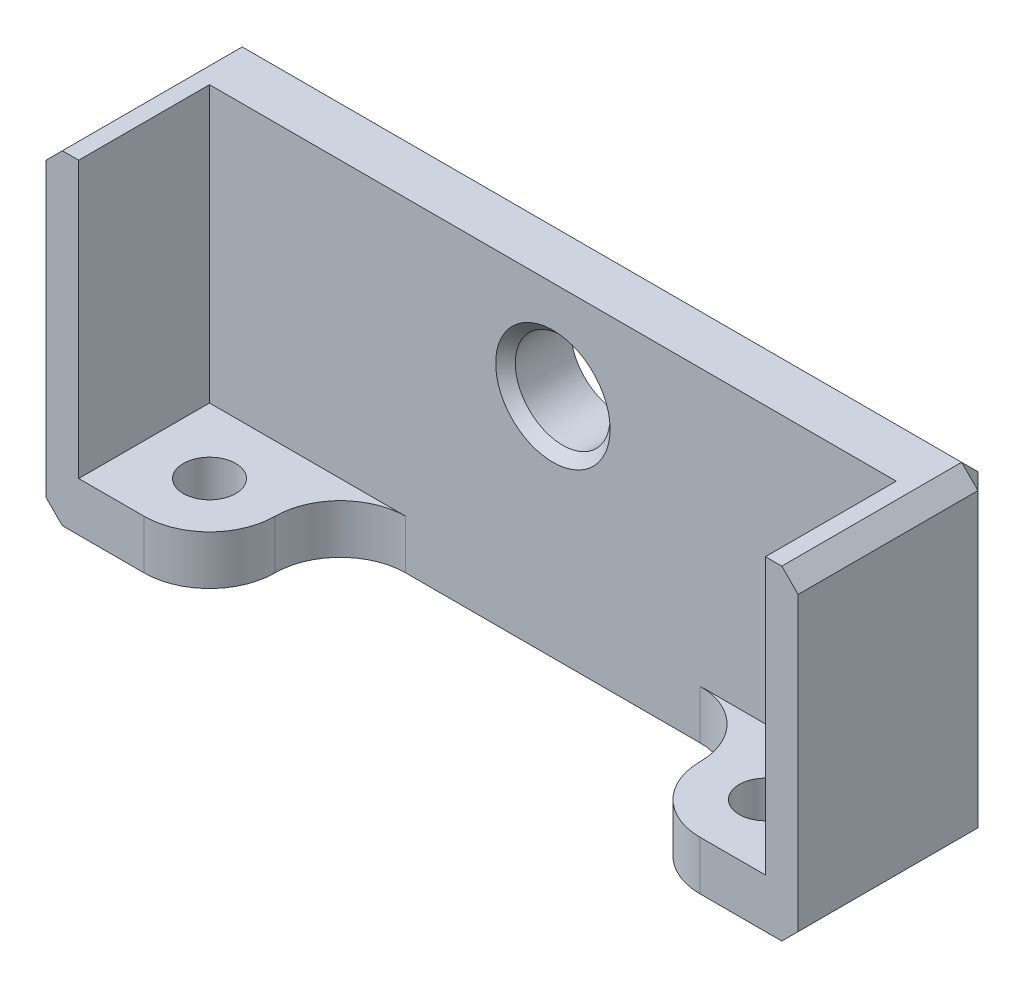
ISO-10303-21;
HEADER;
FILE_DESCRIPTION(('STEP AP214'),'2;1');
FILE_NAME('part.step','',(''),(''),'','','');
FILE_SCHEMA(('AUTOMOTIVE_DESIGN { 1 0 10303 214 1 1 1 1 }'));
ENDSEC;
DATA;
#1=APPLICATION_CONTEXT('core data for automotive mechanical design processes');
#2=APPLICATION_PROTOCOL_DEFINITION('international standard','automotive_design',2000,#1);
#3=PRODUCT_CONTEXT('',#1,'mechanical');
#4=PRODUCT('Part','Part','',(#3));
#5=PRODUCT_RELATED_PRODUCT_CATEGORY('part','',(#4));
#6=PRODUCT_DEFINITION_FORMATION('','',#4);
#7=PRODUCT_DEFINITION_CONTEXT('part definition',#1,'design');
#8=PRODUCT_DEFINITION('design','',#6,#7);
#9=PRODUCT_DEFINITION_SHAPE('','',#8);
#10=(LENGTH_UNIT() NAMED_UNIT(*) SI_UNIT(.MILLI.,.METRE.));
#11=(NAMED_UNIT(*) PLANE_ANGLE_UNIT() SI_UNIT($,.RADIAN.));
#12=(NAMED_UNIT(*) SI_UNIT($,.STERADIAN.) SOLID_ANGLE_UNIT());
#13=UNCERTAINTY_MEASURE_WITH_UNIT(LENGTH_MEASURE(1.E-05),#10,'distance_accuracy_value','');
#14=(GEOMETRIC_REPRESENTATION_CONTEXT(3) GLOBAL_UNCERTAINTY_ASSIGNED_CONTEXT((#13)) GLOBAL_UNIT_ASSIGNED_CONTEXT((#10,
#11,#12)) REPRESENTATION_CONTEXT('',''));
#15=CARTESIAN_POINT('',(0.,0.,0.));
#16=DIRECTION('',(0.,0.,1.));
#17=DIRECTION('',(1.,0.,0.));
#18=AXIS2_PLACEMENT_3D('',#15,#16,#17);
#19=CARTESIAN_POINT('',(0.,0.,4.));
#20=DIRECTION('',(0.,0.,1.));
#21=DIRECTION('',(1.,0.,0.));
#22=AXIS2_PLACEMENT_3D('',#19,#20,#21);
#23=PLANE('',#22);
#24=DIRECTION('',(1.,0.,0.));
#25=VECTOR('',#24,1.);
#26=CARTESIAN_POINT('',(7.93725393319378,-13.86,4.));
#27=LINE('',#26,#25);
#28=CARTESIAN_POINT('',(-9.,-13.86,4.));
#29=VERTEX_POINT('',#28);
#30=CARTESIAN_POINT('',(9.00000000000001,-13.86,4.));
#31=VERTEX_POINT('',#30);
#32=EDGE_CURVE('E231',#29,#31,#27,.T.);
#33=ORIENTED_EDGE('',*,*,#32,.T.);
#34=DIRECTION('',(0.,-1.,0.));
#35=VECTOR('',#34,1.);
#36=CARTESIAN_POINT('',(9.00000000000001,-10.86,4.));
#37=LINE('',#36,#35);
#38=CARTESIAN_POINT('',(9.00000000000001,-10.86,4.));
#39=VERTEX_POINT('',#38);
#40=EDGE_CURVE('E254',#31,#39,#37,.F.);
#41=ORIENTED_EDGE('',*,*,#40,.T.);
#42=DIRECTION('',(-1.,0.,0.));
#43=VECTOR('',#42,1.);
#44=CARTESIAN_POINT('',(0.,-10.86,4.));
#45=LINE('',#44,#43);
#46=CARTESIAN_POINT('',(21.,-10.86,4.));
#47=VERTEX_POINT('',#46);
#48=EDGE_CURVE('E446',#47,#39,#45,.T.);
#49=ORIENTED_EDGE('',*,*,#48,.F.);
#50=DIRECTION('',(0.,1.,0.));
#51=VECTOR('',#50,1.);
#52=CARTESIAN_POINT('',(21.,-13.86,4.));
#53=LINE('',#52,#51);
#54=CARTESIAN_POINT('',(21.,6.,4.));
#55=VERTEX_POINT('',#54);
#56=EDGE_CURVE('E235',#47,#55,#53,.T.);
#57=ORIENTED_EDGE('',*,*,#56,.T.);
#58=DIRECTION('',(-1.,0.,0.));
#59=VECTOR('',#58,1.);
#60=CARTESIAN_POINT('',(21.,6.,4.));
#61=LINE('',#60,#59);
#62=CARTESIAN_POINT('',(-21.,6.,4.));
#63=VERTEX_POINT('',#62);
#64=EDGE_CURVE('E238',#55,#63,#61,.T.);
#65=ORIENTED_EDGE('',*,*,#64,.T.);
#66=DIRECTION('',(0.,-1.,0.));
#67=VECTOR('',#66,1.);
#68=CARTESIAN_POINT('',(-21.,-13.86,4.));
#69=LINE('',#68,#67);
#70=CARTESIAN_POINT('',(-21.,-10.86,4.));
#71=VERTEX_POINT('',#70);
#72=EDGE_CURVE('E228',#63,#71,#69,.T.);
#73=ORIENTED_EDGE('',*,*,#72,.T.);
#74=DIRECTION('',(-1.,0.,0.));
#75=VECTOR('',#74,1.);
#76=CARTESIAN_POINT('',(0.,-10.86,4.));
#77=LINE('',#76,#75);
#78=CARTESIAN_POINT('',(-9.,-10.86,4.));
#79=VERTEX_POINT('',#78);
#80=EDGE_CURVE('E199',#79,#71,#77,.T.);
#81=ORIENTED_EDGE('',*,*,#80,.F.);
#82=DIRECTION('',(0.,1.,0.));
#83=VECTOR('',#82,1.);
#84=CARTESIAN_POINT('',(-9.,-13.86,4.));
#85=LINE('',#84,#83);
#86=EDGE_CURVE('E250',#79,#29,#85,.F.);
#87=ORIENTED_EDGE('',*,*,#86,.T.);
#88=EDGE_LOOP('',(#33,#41,#49,#57,#65,#73,#81,#87));
#89=FACE_BOUND('',#88,.T.);
#90=CARTESIAN_POINT('',(0.,0.,4.));
#91=DIRECTION('',(0.,0.,1.));
#92=DIRECTION('',(1.,0.,0.));
#93=AXIS2_PLACEMENT_3D('',#90,#91,#92);
#94=CIRCLE('',#93,3.5);
#95=CARTESIAN_POINT('',(3.5,0.,4.));
#96=VERTEX_POINT('',#95);
#97=EDGE_CURVE('E246',#96,#96,#94,.F.);
#98=ORIENTED_EDGE('',*,*,#97,.T.);
#99=EDGE_LOOP('',(#98));
#100=FACE_BOUND('',#99,.T.);
#101=ADVANCED_FACE('F41',(#89,#100),#23,.T.);
#102=CARTESIAN_POINT('',(0.,0.,0.));
#103=DIRECTION('',(0.,0.,1.));
#104=DIRECTION('',(1.,0.,0.));
#105=AXIS2_PLACEMENT_3D('',#102,#103,#104);
#106=PLANE('',#105);
#107=DIRECTION('',(1.,0.,0.));
#108=VECTOR('',#107,1.);
#109=CARTESIAN_POINT('',(0.,4.99999999999999,0.));
#110=LINE('',#109,#108);
#111=CARTESIAN_POINT('',(-22.,4.99999999999998,0.));
#112=VERTEX_POINT('',#111);
#113=CARTESIAN_POINT('',(22.,4.99999999999999,0.));
#114=VERTEX_POINT('',#113);
#115=EDGE_CURVE('E347',#112,#114,#110,.T.);
#116=ORIENTED_EDGE('',*,*,#115,.T.);
#117=DIRECTION('',(0.,-1.,0.));
#118=VECTOR('',#117,1.);
#119=CARTESIAN_POINT('',(22.,0.,0.));
#120=LINE('',#119,#118);
#121=CARTESIAN_POINT('',(22.,-12.86,0.));
#122=VERTEX_POINT('',#121);
#123=EDGE_CURVE('E11',#114,#122,#120,.T.);
#124=ORIENTED_EDGE('',*,*,#123,.T.);
#125=DIRECTION('',(-1.,0.,0.));
#126=VECTOR('',#125,1.);
#127=CARTESIAN_POINT('',(0.,-12.86,0.));
#128=LINE('',#127,#126);
#129=CARTESIAN_POINT('',(-22.,-12.86,0.));
#130=VERTEX_POINT('',#129);
#131=EDGE_CURVE('E52',#122,#130,#128,.T.);
#132=ORIENTED_EDGE('',*,*,#131,.T.);
#133=DIRECTION('',(0.,1.,0.));
#134=VECTOR('',#133,1.);
#135=CARTESIAN_POINT('',(-22.,0.,0.));
#136=LINE('',#135,#134);
#137=EDGE_CURVE('E350',#130,#112,#136,.T.);
#138=ORIENTED_EDGE('',*,*,#137,.T.);
#139=EDGE_LOOP('',(#116,#124,#132,#138));
#140=FACE_BOUND('',#139,.T.);
#141=CARTESIAN_POINT('',(0.,0.,0.));
#142=DIRECTION('',(0.,0.,1.));
#143=DIRECTION('',(1.,0.,0.));
#144=AXIS2_PLACEMENT_3D('',#141,#142,#143);
#145=CIRCLE('',#144,2.9);
#146=CARTESIAN_POINT('',(2.9,0.,0.));
#147=VERTEX_POINT('',#146);
#148=EDGE_CURVE('E224',#147,#147,#145,.T.);
#149=ORIENTED_EDGE('',*,*,#148,.T.);
#150=EDGE_LOOP('',(#149));
#151=FACE_BOUND('',#150,.T.);
#152=ADVANCED_FACE('F471',(#140,#151),#106,.F.);
#153=CARTESIAN_POINT('',(21.,-13.86,4.));
#154=DIRECTION('',(0.,1.,0.));
#155=DIRECTION('',(-1.,0.,0.));
#156=AXIS2_PLACEMENT_3D('',#153,#154,#155);
#157=PLANE('',#156);
#158=DIRECTION('',(1.,0.,0.));
#159=VECTOR('',#158,1.);
#160=CARTESIAN_POINT('',(-23.,-13.86,12.));
#161=LINE('',#160,#159);
#162=CARTESIAN_POINT('',(-22.,-13.86,12.));
#163=VERTEX_POINT('',#162);
#164=CARTESIAN_POINT('',(-17.,-13.86,12.));
#165=VERTEX_POINT('',#164);
#166=EDGE_CURVE('E218',#163,#165,#161,.T.);
#167=ORIENTED_EDGE('',*,*,#166,.F.);
#168=DIRECTION('',(0.,0.,-1.));
#169=VECTOR('',#168,1.);
#170=CARTESIAN_POINT('',(-22.,-13.86,4.));
#171=LINE('',#170,#169);
#172=CARTESIAN_POINT('',(-22.,-13.86,1.00000000000001));
#173=VERTEX_POINT('',#172);
#174=EDGE_CURVE('E320',#163,#173,#171,.T.);
#175=ORIENTED_EDGE('',*,*,#174,.T.);
#176=DIRECTION('',(1.,0.,0.));
#177=VECTOR('',#176,1.);
#178=CARTESIAN_POINT('',(21.,-13.86,1.00000000000001));
#179=LINE('',#178,#177);
#180=CARTESIAN_POINT('',(22.,-13.86,1.00000000000001));
#181=VERTEX_POINT('',#180);
#182=EDGE_CURVE('E314',#173,#181,#179,.T.);
#183=ORIENTED_EDGE('',*,*,#182,.T.);
#184=DIRECTION('',(0.,0.,1.));
#185=VECTOR('',#184,1.);
#186=CARTESIAN_POINT('',(22.,-13.86,4.));
#187=LINE('',#186,#185);
#188=CARTESIAN_POINT('',(22.,-13.86,12.));
#189=VERTEX_POINT('',#188);
#190=EDGE_CURVE('E317',#181,#189,#187,.T.);
#191=ORIENTED_EDGE('',*,*,#190,.T.);
#192=DIRECTION('',(-1.,0.,0.));
#193=VECTOR('',#192,1.);
#194=CARTESIAN_POINT('',(23.,-13.86,12.));
#195=LINE('',#194,#193);
#196=CARTESIAN_POINT('',(17.,-13.86,12.));
#197=VERTEX_POINT('',#196);
#198=EDGE_CURVE('E208',#189,#197,#195,.T.);
#199=ORIENTED_EDGE('',*,*,#198,.T.);
#200=CARTESIAN_POINT('',(17.,-13.86,8.));
#201=DIRECTION('',(0.,1.,0.));
#202=DIRECTION('',(-1.,0.,0.));
#203=AXIS2_PLACEMENT_3D('',#200,#201,#202);
#204=CIRCLE('',#203,4.);
#205=CARTESIAN_POINT('',(13.,-13.86,8.));
#206=VERTEX_POINT('',#205);
#207=EDGE_CURVE('E266',#197,#206,#204,.F.);
#208=ORIENTED_EDGE('',*,*,#207,.T.);
#209=CARTESIAN_POINT('',(9.00000000000001,-13.86,8.));
#210=DIRECTION('',(0.,1.,0.));
#211=DIRECTION('',(-1.,0.,0.));
#212=AXIS2_PLACEMENT_3D('',#209,#210,#211);
#213=CIRCLE('',#212,4.);
#214=EDGE_CURVE('E277',#206,#31,#213,.T.);
#215=ORIENTED_EDGE('',*,*,#214,.T.);
#216=ORIENTED_EDGE('',*,*,#32,.F.);
#217=CARTESIAN_POINT('',(-9.,-13.86,8.));
#218=DIRECTION('',(0.,1.,0.));
#219=DIRECTION('',(-1.,0.,0.));
#220=AXIS2_PLACEMENT_3D('',#217,#218,#219);
#221=CIRCLE('',#220,4.);
#222=CARTESIAN_POINT('',(-13.,-13.86,8.));
#223=VERTEX_POINT('',#222);
#224=EDGE_CURVE('E286',#29,#223,#221,.T.);
#225=ORIENTED_EDGE('',*,*,#224,.T.);
#226=CARTESIAN_POINT('',(-17.,-13.86,8.));
#227=DIRECTION('',(0.,1.,0.));
#228=DIRECTION('',(-1.,0.,0.));
#229=AXIS2_PLACEMENT_3D('',#226,#227,#228);
#230=CIRCLE('',#229,4.);
#231=EDGE_CURVE('E262',#223,#165,#230,.F.);
#232=ORIENTED_EDGE('',*,*,#231,.T.);
#233=EDGE_LOOP('',(#167,#175,#183,#191,#199,#208,#215,#216,#225,#232));
#234=FACE_BOUND('',#233,.T.);
#235=CARTESIAN_POINT('',(-17.,-13.86,8.));
#236=DIRECTION('',(0.,-1.,0.));
#237=DIRECTION('',(1.,0.,0.));
#238=AXIS2_PLACEMENT_3D('',#235,#236,#237);
#239=CIRCLE('',#238,1.6);
#240=CARTESIAN_POINT('',(-15.4,-13.86,8.));
#241=VERTEX_POINT('',#240);
#242=EDGE_CURVE('E442',#241,#241,#239,.T.);
#243=ORIENTED_EDGE('',*,*,#242,.F.);
#244=EDGE_LOOP('',(#243));
#245=FACE_BOUND('',#244,.T.);
#246=CARTESIAN_POINT('',(17.,-13.86,8.));
#247=DIRECTION('',(0.,-1.,0.));
#248=DIRECTION('',(-1.,0.,0.));
#249=AXIS2_PLACEMENT_3D('',#246,#247,#248);
#250=CIRCLE('',#249,1.6);
#251=CARTESIAN_POINT('',(15.4,-13.86,8.));
#252=VERTEX_POINT('',#251);
#253=EDGE_CURVE('E294',#252,#252,#250,.T.);
#254=ORIENTED_EDGE('',*,*,#253,.F.);
#255=EDGE_LOOP('',(#254));
#256=FACE_BOUND('',#255,.T.);
#257=ADVANCED_FACE('F468',(#234,#245,#256),#157,.F.);
#258=CARTESIAN_POINT('',(7.93725393319377,6.,4.));
#259=DIRECTION('',(0.,-1.,0.));
#260=DIRECTION('',(1.,0.,0.));
#261=AXIS2_PLACEMENT_3D('',#258,#259,#260);
#262=PLANE('',#261);
#263=DIRECTION('',(-1.,0.,0.));
#264=VECTOR('',#263,1.);
#265=CARTESIAN_POINT('',(7.93725393319377,6.,1.00000000000001));
#266=LINE('',#265,#264);
#267=CARTESIAN_POINT('',(22.,6.,1.00000000000001));
#268=VERTEX_POINT('',#267);
#269=CARTESIAN_POINT('',(-22.,6.,1.00000000000001));
#270=VERTEX_POINT('',#269);
#271=EDGE_CURVE('E323',#268,#270,#266,.T.);
#272=ORIENTED_EDGE('',*,*,#271,.T.);
#273=DIRECTION('',(0.,0.,1.));
#274=VECTOR('',#273,1.);
#275=CARTESIAN_POINT('',(-22.,6.,4.));
#276=LINE('',#275,#274);
#277=CARTESIAN_POINT('',(-22.,6.,12.));
#278=VERTEX_POINT('',#277);
#279=EDGE_CURVE('E329',#270,#278,#276,.T.);
#280=ORIENTED_EDGE('',*,*,#279,.T.);
#281=DIRECTION('',(1.,0.,0.));
#282=VECTOR('',#281,1.);
#283=CARTESIAN_POINT('',(-23.,6.,12.));
#284=LINE('',#283,#282);
#285=CARTESIAN_POINT('',(-21.,6.,12.));
#286=VERTEX_POINT('',#285);
#287=EDGE_CURVE('E221',#278,#286,#284,.T.);
#288=ORIENTED_EDGE('',*,*,#287,.T.);
#289=DIRECTION('',(0.,0.,-1.));
#290=VECTOR('',#289,1.);
#291=CARTESIAN_POINT('',(-21.,6.,12.));
#292=LINE('',#291,#290);
#293=EDGE_CURVE('E206',#286,#63,#292,.T.);
#294=ORIENTED_EDGE('',*,*,#293,.T.);
#295=ORIENTED_EDGE('',*,*,#64,.F.);
#296=DIRECTION('',(0.,0.,-1.));
#297=VECTOR('',#296,1.);
#298=CARTESIAN_POINT('',(21.,6.,12.));
#299=LINE('',#298,#297);
#300=CARTESIAN_POINT('',(21.,6.,12.));
#301=VERTEX_POINT('',#300);
#302=EDGE_CURVE('E423',#301,#55,#299,.T.);
#303=ORIENTED_EDGE('',*,*,#302,.F.);
#304=DIRECTION('',(-1.,0.,0.));
#305=VECTOR('',#304,1.);
#306=CARTESIAN_POINT('',(23.,6.,12.));
#307=LINE('',#306,#305);
#308=CARTESIAN_POINT('',(22.,6.,12.));
#309=VERTEX_POINT('',#308);
#310=EDGE_CURVE('E214',#309,#301,#307,.T.);
#311=ORIENTED_EDGE('',*,*,#310,.F.);
#312=DIRECTION('',(0.,0.,-1.));
#313=VECTOR('',#312,1.);
#314=CARTESIAN_POINT('',(22.,6.,4.));
#315=LINE('',#314,#313);
#316=EDGE_CURVE('E326',#309,#268,#315,.T.);
#317=ORIENTED_EDGE('',*,*,#316,.T.);
#318=EDGE_LOOP('',(#272,#280,#288,#294,#295,#303,#311,#317));
#319=FACE_BOUND('',#318,.T.);
#320=ADVANCED_FACE('F470',(#319),#262,.F.);
#321=CARTESIAN_POINT('',(0.,0.,4.));
#322=DIRECTION('',(0.,0.,-1.));
#323=DIRECTION('',(-1.,0.,0.));
#324=AXIS2_PLACEMENT_3D('',#321,#322,#323);
#325=CYLINDRICAL_SURFACE('',#324,2.9);
#326=CARTESIAN_POINT('',(0.,0.,3.4));
#327=DIRECTION('',(0.,0.,1.));
#328=DIRECTION('',(1.,0.,0.));
#329=AXIS2_PLACEMENT_3D('',#326,#327,#328);
#330=CIRCLE('',#329,2.9);
#331=CARTESIAN_POINT('',(2.9,0.,3.4));
#332=VERTEX_POINT('',#331);
#333=EDGE_CURVE('E242',#332,#332,#330,.T.);
#334=ORIENTED_EDGE('',*,*,#333,.T.);
#335=EDGE_LOOP('',(#334));
#336=FACE_BOUND('',#335,.T.);
#337=ORIENTED_EDGE('',*,*,#148,.F.);
#338=EDGE_LOOP('',(#337));
#339=FACE_BOUND('',#338,.T.);
#340=ADVANCED_FACE('F478',(#336,#339),#325,.F.);
#341=CARTESIAN_POINT('',(0.,0.,3.4));
#342=DIRECTION('',(0.,0.,1.));
#343=DIRECTION('',(1.,0.,0.));
#344=AXIS2_PLACEMENT_3D('',#341,#342,#343);
#345=CONICAL_SURFACE('',#344,2.9,0.785398163397449);
#346=ORIENTED_EDGE('',*,*,#97,.F.);
#347=EDGE_LOOP('',(#346));
#348=FACE_BOUND('',#347,.T.);
#349=ORIENTED_EDGE('',*,*,#333,.F.);
#350=EDGE_LOOP('',(#349));
#351=FACE_BOUND('',#350,.T.);
#352=ADVANCED_FACE('F494',(#348,#351),#345,.F.);
#353=CARTESIAN_POINT('',(-21.,0.,0.));
#354=DIRECTION('',(1.,0.,0.));
#355=DIRECTION('',(0.,1.,0.));
#356=AXIS2_PLACEMENT_3D('',#353,#354,#355);
#357=PLANE('',#356);
#358=DIRECTION('',(0.,0.,1.));
#359=VECTOR('',#358,1.);
#360=CARTESIAN_POINT('',(-21.,-10.86,0.));
#361=LINE('',#360,#359);
#362=CARTESIAN_POINT('',(-21.,-10.86,12.));
#363=VERTEX_POINT('',#362);
#364=EDGE_CURVE('E193',#71,#363,#361,.T.);
#365=ORIENTED_EDGE('',*,*,#364,.F.);
#366=ORIENTED_EDGE('',*,*,#72,.F.);
#367=ORIENTED_EDGE('',*,*,#293,.F.);
#368=DIRECTION('',(0.,1.,0.));
#369=VECTOR('',#368,1.);
#370=CARTESIAN_POINT('',(-21.,6.,12.));
#371=LINE('',#370,#369);
#372=EDGE_CURVE('E186',#363,#286,#371,.T.);
#373=ORIENTED_EDGE('',*,*,#372,.F.);
#374=EDGE_LOOP('',(#365,#366,#367,#373));
#375=FACE_BOUND('',#374,.T.);
#376=ADVANCED_FACE('F204',(#375),#357,.T.);
#377=CARTESIAN_POINT('',(-23.,6.,12.));
#378=DIRECTION('',(0.,0.,-1.));
#379=DIRECTION('',(0.,1.,0.));
#380=AXIS2_PLACEMENT_3D('',#377,#378,#379);
#381=PLANE('',#380);
#382=DIRECTION('',(0.,1.,0.));
#383=VECTOR('',#382,1.);
#384=CARTESIAN_POINT('',(-23.,6.,12.));
#385=LINE('',#384,#383);
#386=CARTESIAN_POINT('',(-23.,-12.86,12.));
#387=VERTEX_POINT('',#386);
#388=CARTESIAN_POINT('',(-23.,4.99999999999999,12.));
#389=VERTEX_POINT('',#388);
#390=EDGE_CURVE('E212',#387,#389,#385,.T.);
#391=ORIENTED_EDGE('',*,*,#390,.F.);
#392=DIRECTION('',(-0.707106781186548,0.707106781186548,0.));
#393=VECTOR('',#392,1.);
#394=CARTESIAN_POINT('',(-23.,-12.86,12.));
#395=LINE('',#394,#393);
#396=EDGE_CURVE('E311',#387,#163,#395,.F.);
#397=ORIENTED_EDGE('',*,*,#396,.T.);
#398=ORIENTED_EDGE('',*,*,#166,.T.);
#399=DIRECTION('',(0.,-1.,0.));
#400=VECTOR('',#399,1.);
#401=CARTESIAN_POINT('',(-17.,-10.86,12.));
#402=LINE('',#401,#400);
#403=CARTESIAN_POINT('',(-17.,-10.86,12.));
#404=VERTEX_POINT('',#403);
#405=EDGE_CURVE('E189',#165,#404,#402,.F.);
#406=ORIENTED_EDGE('',*,*,#405,.T.);
#407=DIRECTION('',(-1.,0.,0.));
#408=VECTOR('',#407,1.);
#409=CARTESIAN_POINT('',(-23.,-10.86,12.));
#410=LINE('',#409,#408);
#411=EDGE_CURVE('E180',#404,#363,#410,.T.);
#412=ORIENTED_EDGE('',*,*,#411,.T.);
#413=ORIENTED_EDGE('',*,*,#372,.T.);
#414=ORIENTED_EDGE('',*,*,#287,.F.);
#415=DIRECTION('',(0.707106781186548,0.707106781186548,0.));
#416=VECTOR('',#415,1.);
#417=CARTESIAN_POINT('',(-23.,4.99999999999998,12.));
#418=LINE('',#417,#416);
#419=EDGE_CURVE('E308',#278,#389,#418,.F.);
#420=ORIENTED_EDGE('',*,*,#419,.T.);
#421=EDGE_LOOP('',(#391,#397,#398,#406,#412,#413,#414,#420));
#422=FACE_BOUND('',#421,.T.);
#423=ADVANCED_FACE('F183',(#422),#381,.F.);
#424=CARTESIAN_POINT('',(-23.,0.,0.));
#425=DIRECTION('',(1.,0.,0.));
#426=DIRECTION('',(0.,1.,0.));
#427=AXIS2_PLACEMENT_3D('',#424,#425,#426);
#428=PLANE('',#427);
#429=DIRECTION('',(0.,-1.,0.));
#430=VECTOR('',#429,1.);
#431=CARTESIAN_POINT('',(-23.,0.,1.00000000000001));
#432=LINE('',#431,#430);
#433=CARTESIAN_POINT('',(-23.,4.99999999999999,1.00000000000001));
#434=VERTEX_POINT('',#433);
#435=CARTESIAN_POINT('',(-23.,-12.86,1.00000000000001));
#436=VERTEX_POINT('',#435);
#437=EDGE_CURVE('E289',#434,#436,#432,.T.);
#438=ORIENTED_EDGE('',*,*,#437,.T.);
#439=DIRECTION('',(0.,0.,1.));
#440=VECTOR('',#439,1.);
#441=CARTESIAN_POINT('',(-23.,-12.86,0.));
#442=LINE('',#441,#440);
#443=EDGE_CURVE('E304',#436,#387,#442,.T.);
#444=ORIENTED_EDGE('',*,*,#443,.T.);
#445=ORIENTED_EDGE('',*,*,#390,.T.);
#446=DIRECTION('',(0.,0.,-1.));
#447=VECTOR('',#446,1.);
#448=CARTESIAN_POINT('',(-23.,4.99999999999999,0.));
#449=LINE('',#448,#447);
#450=EDGE_CURVE('E301',#389,#434,#449,.T.);
#451=ORIENTED_EDGE('',*,*,#450,.T.);
#452=EDGE_LOOP('',(#438,#444,#445,#451));
#453=FACE_BOUND('',#452,.T.);
#454=ADVANCED_FACE('F498',(#453),#428,.F.);
#455=CARTESIAN_POINT('',(21.,0.,0.));
#456=DIRECTION('',(-1.,0.,0.));
#457=DIRECTION('',(0.,1.,0.));
#458=AXIS2_PLACEMENT_3D('',#455,#456,#457);
#459=PLANE('',#458);
#460=DIRECTION('',(0.,0.,-1.));
#461=VECTOR('',#460,1.);
#462=CARTESIAN_POINT('',(21.,-10.86,0.));
#463=LINE('',#462,#461);
#464=CARTESIAN_POINT('',(21.,-10.86,12.));
#465=VERTEX_POINT('',#464);
#466=EDGE_CURVE('E449',#465,#47,#463,.T.);
#467=ORIENTED_EDGE('',*,*,#466,.F.);
#468=DIRECTION('',(0.,1.,0.));
#469=VECTOR('',#468,1.);
#470=CARTESIAN_POINT('',(21.,6.,12.));
#471=LINE('',#470,#469);
#472=EDGE_CURVE('E429',#465,#301,#471,.T.);
#473=ORIENTED_EDGE('',*,*,#472,.T.);
#474=ORIENTED_EDGE('',*,*,#302,.T.);
#475=ORIENTED_EDGE('',*,*,#56,.F.);
#476=EDGE_LOOP('',(#467,#473,#474,#475));
#477=FACE_BOUND('',#476,.T.);
#478=ADVANCED_FACE('F503',(#477),#459,.T.);
#479=CARTESIAN_POINT('',(23.,6.,12.));
#480=DIRECTION('',(0.,0.,1.));
#481=DIRECTION('',(0.,-1.,0.));
#482=AXIS2_PLACEMENT_3D('',#479,#480,#481);
#483=PLANE('',#482);
#484=DIRECTION('',(0.,1.,0.));
#485=VECTOR('',#484,1.);
#486=CARTESIAN_POINT('',(23.,6.,12.));
#487=LINE('',#486,#485);
#488=CARTESIAN_POINT('',(23.,-12.86,12.));
#489=VERTEX_POINT('',#488);
#490=CARTESIAN_POINT('',(23.,4.99999999999999,12.));
#491=VERTEX_POINT('',#490);
#492=EDGE_CURVE('E415',#489,#491,#487,.T.);
#493=ORIENTED_EDGE('',*,*,#492,.T.);
#494=DIRECTION('',(0.707106781186549,-0.707106781186546,0.));
#495=VECTOR('',#494,1.);
#496=CARTESIAN_POINT('',(22.5,5.49999999999999,12.));
#497=LINE('',#496,#495);
#498=EDGE_CURVE('E344',#491,#309,#497,.F.);
#499=ORIENTED_EDGE('',*,*,#498,.T.);
#500=ORIENTED_EDGE('',*,*,#310,.T.);
#501=ORIENTED_EDGE('',*,*,#472,.F.);
#502=DIRECTION('',(-1.,0.,0.));
#503=VECTOR('',#502,1.);
#504=CARTESIAN_POINT('',(23.,-10.86,12.));
#505=LINE('',#504,#503);
#506=CARTESIAN_POINT('',(17.,-10.86,12.));
#507=VERTEX_POINT('',#506);
#508=EDGE_CURVE('E453',#465,#507,#505,.T.);
#509=ORIENTED_EDGE('',*,*,#508,.T.);
#510=DIRECTION('',(0.,-1.,0.));
#511=VECTOR('',#510,1.);
#512=CARTESIAN_POINT('',(17.,6.,12.));
#513=LINE('',#512,#511);
#514=EDGE_CURVE('E258',#507,#197,#513,.T.);
#515=ORIENTED_EDGE('',*,*,#514,.T.);
#516=ORIENTED_EDGE('',*,*,#198,.F.);
#517=DIRECTION('',(-0.707106781186548,-0.707106781186548,0.));
#518=VECTOR('',#517,1.);
#519=CARTESIAN_POINT('',(32.43,-3.42999999999999,12.));
#520=LINE('',#519,#518);
#521=EDGE_CURVE('E341',#189,#489,#520,.F.);
#522=ORIENTED_EDGE('',*,*,#521,.T.);
#523=EDGE_LOOP('',(#493,#499,#500,#501,#509,#515,#516,#522));
#524=FACE_BOUND('',#523,.T.);
#525=ADVANCED_FACE('F418',(#524),#483,.T.);
#526=CARTESIAN_POINT('',(23.,0.,0.));
#527=DIRECTION('',(-1.,0.,0.));
#528=DIRECTION('',(0.,1.,0.));
#529=AXIS2_PLACEMENT_3D('',#526,#527,#528);
#530=PLANE('',#529);
#531=DIRECTION('',(0.,1.,0.));
#532=VECTOR('',#531,1.);
#533=CARTESIAN_POINT('',(23.,0.,1.00000000000001));
#534=LINE('',#533,#532);
#535=CARTESIAN_POINT('',(23.,-12.86,1.00000000000001));
#536=VERTEX_POINT('',#535);
#537=CARTESIAN_POINT('',(23.,4.99999999999999,1.00000000000001));
#538=VERTEX_POINT('',#537);
#539=EDGE_CURVE('E332',#536,#538,#534,.T.);
#540=ORIENTED_EDGE('',*,*,#539,.T.);
#541=DIRECTION('',(0.,0.,1.));
#542=VECTOR('',#541,1.);
#543=CARTESIAN_POINT('',(23.,4.99999999999999,0.));
#544=LINE('',#543,#542);
#545=EDGE_CURVE('E338',#538,#491,#544,.T.);
#546=ORIENTED_EDGE('',*,*,#545,.T.);
#547=ORIENTED_EDGE('',*,*,#492,.F.);
#548=DIRECTION('',(0.,0.,-1.));
#549=VECTOR('',#548,1.);
#550=CARTESIAN_POINT('',(23.,-12.86,0.));
#551=LINE('',#550,#549);
#552=EDGE_CURVE('E335',#489,#536,#551,.T.);
#553=ORIENTED_EDGE('',*,*,#552,.T.);
#554=EDGE_LOOP('',(#540,#546,#547,#553));
#555=FACE_BOUND('',#554,.T.);
#556=ADVANCED_FACE('F414',(#555),#530,.F.);
#557=CARTESIAN_POINT('',(0.,-10.86,0.));
#558=DIRECTION('',(0.,1.,0.));
#559=DIRECTION('',(-1.,0.,0.));
#560=AXIS2_PLACEMENT_3D('',#557,#558,#559);
#561=PLANE('',#560);
#562=CARTESIAN_POINT('',(-17.,-10.86,8.));
#563=DIRECTION('',(0.,-1.,0.));
#564=DIRECTION('',(1.,0.,0.));
#565=AXIS2_PLACEMENT_3D('',#562,#563,#564);
#566=CIRCLE('',#565,1.6);
#567=CARTESIAN_POINT('',(-15.4,-10.86,8.));
#568=VERTEX_POINT('',#567);
#569=EDGE_CURVE('E194',#568,#568,#566,.T.);
#570=ORIENTED_EDGE('',*,*,#569,.T.);
#571=EDGE_LOOP('',(#570));
#572=FACE_BOUND('',#571,.T.);
#573=ORIENTED_EDGE('',*,*,#411,.F.);
#574=CARTESIAN_POINT('',(-17.,-10.86,8.));
#575=DIRECTION('',(0.,1.,0.));
#576=DIRECTION('',(-1.,0.,0.));
#577=AXIS2_PLACEMENT_3D('',#574,#575,#576);
#578=CIRCLE('',#577,4.);
#579=CARTESIAN_POINT('',(-13.,-10.86,8.));
#580=VERTEX_POINT('',#579);
#581=EDGE_CURVE('E274',#404,#580,#578,.T.);
#582=ORIENTED_EDGE('',*,*,#581,.T.);
#583=CARTESIAN_POINT('',(-9.,-10.86,8.));
#584=DIRECTION('',(0.,1.,0.));
#585=DIRECTION('',(-1.,0.,0.));
#586=AXIS2_PLACEMENT_3D('',#583,#584,#585);
#587=CIRCLE('',#586,4.);
#588=EDGE_CURVE('E283',#580,#79,#587,.F.);
#589=ORIENTED_EDGE('',*,*,#588,.T.);
#590=ORIENTED_EDGE('',*,*,#80,.T.);
#591=ORIENTED_EDGE('',*,*,#364,.T.);
#592=EDGE_LOOP('',(#573,#582,#589,#590,#591));
#593=FACE_BOUND('',#592,.T.);
#594=ADVANCED_FACE('F197',(#572,#593),#561,.T.);
#595=CARTESIAN_POINT('',(-17.,-10.86,8.));
#596=DIRECTION('',(0.,-1.,0.));
#597=DIRECTION('',(1.,0.,0.));
#598=AXIS2_PLACEMENT_3D('',#595,#596,#597);
#599=CYLINDRICAL_SURFACE('',#598,1.6);
#600=ORIENTED_EDGE('',*,*,#569,.F.);
#601=EDGE_LOOP('',(#600));
#602=FACE_BOUND('',#601,.T.);
#603=ORIENTED_EDGE('',*,*,#242,.T.);
#604=EDGE_LOOP('',(#603));
#605=FACE_BOUND('',#604,.T.);
#606=ADVANCED_FACE('F513',(#602,#605),#599,.F.);
#607=CARTESIAN_POINT('',(0.,-10.86,0.));
#608=DIRECTION('',(0.,1.,0.));
#609=DIRECTION('',(-1.,0.,0.));
#610=AXIS2_PLACEMENT_3D('',#607,#608,#609);
#611=PLANE('',#610);
#612=CARTESIAN_POINT('',(17.,-10.86,8.));
#613=DIRECTION('',(0.,-1.,0.));
#614=DIRECTION('',(-1.,0.,0.));
#615=AXIS2_PLACEMENT_3D('',#612,#613,#614);
#616=CIRCLE('',#615,1.6);
#617=CARTESIAN_POINT('',(15.4,-10.86,8.));
#618=VERTEX_POINT('',#617);
#619=EDGE_CURVE('E457',#618,#618,#616,.T.);
#620=ORIENTED_EDGE('',*,*,#619,.T.);
#621=EDGE_LOOP('',(#620));
#622=FACE_BOUND('',#621,.T.);
#623=ORIENTED_EDGE('',*,*,#48,.T.);
#624=CARTESIAN_POINT('',(9.00000000000001,-10.86,8.));
#625=DIRECTION('',(0.,1.,0.));
#626=DIRECTION('',(-1.,0.,0.));
#627=AXIS2_PLACEMENT_3D('',#624,#625,#626);
#628=CIRCLE('',#627,4.);
#629=CARTESIAN_POINT('',(13.,-10.86,8.));
#630=VERTEX_POINT('',#629);
#631=EDGE_CURVE('E280',#39,#630,#628,.F.);
#632=ORIENTED_EDGE('',*,*,#631,.T.);
#633=CARTESIAN_POINT('',(17.,-10.86,8.));
#634=DIRECTION('',(0.,1.,0.));
#635=DIRECTION('',(-1.,0.,0.));
#636=AXIS2_PLACEMENT_3D('',#633,#634,#635);
#637=CIRCLE('',#636,4.);
#638=EDGE_CURVE('E269',#630,#507,#637,.T.);
#639=ORIENTED_EDGE('',*,*,#638,.T.);
#640=ORIENTED_EDGE('',*,*,#508,.F.);
#641=ORIENTED_EDGE('',*,*,#466,.T.);
#642=EDGE_LOOP('',(#623,#632,#639,#640,#641));
#643=FACE_BOUND('',#642,.T.);
#644=ADVANCED_FACE('F517',(#622,#643),#611,.T.);
#645=CARTESIAN_POINT('',(17.,-10.86,8.));
#646=DIRECTION('',(0.,-1.,0.));
#647=DIRECTION('',(1.,0.,0.));
#648=AXIS2_PLACEMENT_3D('',#645,#646,#647);
#649=CYLINDRICAL_SURFACE('',#648,1.6);
#650=ORIENTED_EDGE('',*,*,#619,.F.);
#651=EDGE_LOOP('',(#650));
#652=FACE_BOUND('',#651,.T.);
#653=ORIENTED_EDGE('',*,*,#253,.T.);
#654=EDGE_LOOP('',(#653));
#655=FACE_BOUND('',#654,.T.);
#656=ADVANCED_FACE('F466',(#652,#655),#649,.F.);
#657=CARTESIAN_POINT('',(17.,6.,8.));
#658=DIRECTION('',(0.,-1.,0.));
#659=DIRECTION('',(0.,0.,-1.));
#660=AXIS2_PLACEMENT_3D('',#657,#658,#659);
#661=CYLINDRICAL_SURFACE('',#660,4.);
#662=ORIENTED_EDGE('',*,*,#514,.F.);
#663=ORIENTED_EDGE('',*,*,#638,.F.);
#664=DIRECTION('',(0.,-1.,0.));
#665=VECTOR('',#664,1.);
#666=CARTESIAN_POINT('',(13.,-10.86,8.));
#667=LINE('',#666,#665);
#668=EDGE_CURVE('E290',#206,#630,#667,.F.);
#669=ORIENTED_EDGE('',*,*,#668,.F.);
#670=ORIENTED_EDGE('',*,*,#207,.F.);
#671=EDGE_LOOP('',(#662,#663,#669,#670));
#672=FACE_BOUND('',#671,.T.);
#673=ADVANCED_FACE('F523',(#672),#661,.T.);
#674=CARTESIAN_POINT('',(9.00000000000001,-10.86,8.));
#675=DIRECTION('',(0.,1.,0.));
#676=DIRECTION('',(-1.,0.,0.));
#677=AXIS2_PLACEMENT_3D('',#674,#675,#676);
#678=CYLINDRICAL_SURFACE('',#677,4.);
#679=ORIENTED_EDGE('',*,*,#631,.F.);
#680=ORIENTED_EDGE('',*,*,#40,.F.);
#681=ORIENTED_EDGE('',*,*,#214,.F.);
#682=ORIENTED_EDGE('',*,*,#668,.T.);
#683=EDGE_LOOP('',(#679,#680,#681,#682));
#684=FACE_BOUND('',#683,.T.);
#685=ADVANCED_FACE('F528',(#684),#678,.F.);
#686=CARTESIAN_POINT('',(-17.,-10.86,8.));
#687=DIRECTION('',(0.,1.,0.));
#688=DIRECTION('',(0.,0.,1.));
#689=AXIS2_PLACEMENT_3D('',#686,#687,#688);
#690=CYLINDRICAL_SURFACE('',#689,4.);
#691=ORIENTED_EDGE('',*,*,#405,.F.);
#692=ORIENTED_EDGE('',*,*,#231,.F.);
#693=DIRECTION('',(0.,-1.,0.));
#694=VECTOR('',#693,1.);
#695=CARTESIAN_POINT('',(-13.,-13.86,8.));
#696=LINE('',#695,#694);
#697=EDGE_CURVE('E295',#580,#223,#696,.T.);
#698=ORIENTED_EDGE('',*,*,#697,.F.);
#699=ORIENTED_EDGE('',*,*,#581,.F.);
#700=EDGE_LOOP('',(#691,#692,#698,#699));
#701=FACE_BOUND('',#700,.T.);
#702=ADVANCED_FACE('F641',(#701),#690,.T.);
#703=CARTESIAN_POINT('',(-9.,-10.86,8.));
#704=DIRECTION('',(0.,-1.,0.));
#705=DIRECTION('',(1.,0.,0.));
#706=AXIS2_PLACEMENT_3D('',#703,#704,#705);
#707=CYLINDRICAL_SURFACE('',#706,4.);
#708=ORIENTED_EDGE('',*,*,#224,.F.);
#709=ORIENTED_EDGE('',*,*,#86,.F.);
#710=ORIENTED_EDGE('',*,*,#588,.F.);
#711=ORIENTED_EDGE('',*,*,#697,.T.);
#712=EDGE_LOOP('',(#708,#709,#710,#711));
#713=FACE_BOUND('',#712,.T.);
#714=ADVANCED_FACE('F637',(#713),#707,.F.);
#715=CARTESIAN_POINT('',(22.,6.,4.));
#716=DIRECTION('',(-0.707106781186546,-0.707106781186549,0.));
#717=DIRECTION('',(0.,0.,-1.));
#718=AXIS2_PLACEMENT_3D('',#715,#716,#717);
#719=PLANE('',#718);
#720=DIRECTION('',(-0.707106781186549,0.707106781186546,0.));
#721=VECTOR('',#720,1.);
#722=CARTESIAN_POINT('',(22.,6.,1.00000000000001));
#723=LINE('',#722,#721);
#724=EDGE_CURVE('E46',#268,#538,#723,.F.);
#725=ORIENTED_EDGE('',*,*,#724,.F.);
#726=ORIENTED_EDGE('',*,*,#316,.F.);
#727=ORIENTED_EDGE('',*,*,#498,.F.);
#728=ORIENTED_EDGE('',*,*,#545,.F.);
#729=EDGE_LOOP('',(#725,#726,#727,#728));
#730=FACE_BOUND('',#729,.T.);
#731=ADVANCED_FACE('F44',(#730),#719,.F.);
#732=CARTESIAN_POINT('',(22.,6.,1.00000000000001));
#733=DIRECTION('',(0.577350269189624,0.577350269189627,-0.577350269189626));
#734=DIRECTION('',(0.,0.707106781186546,0.707106781186549));
#735=AXIS2_PLACEMENT_3D('',#732,#733,#734);
#736=PLANE('',#735);
#737=DIRECTION('',(0.,-0.707106781186548,-0.707106781186548));
#738=VECTOR('',#737,1.);
#739=CARTESIAN_POINT('',(22.,6.,1.00000000000001));
#740=LINE('',#739,#738);
#741=EDGE_CURVE('E390',#268,#114,#740,.T.);
#742=ORIENTED_EDGE('',*,*,#741,.F.);
#743=ORIENTED_EDGE('',*,*,#724,.T.);
#744=DIRECTION('',(0.707106781186547,0.,0.707106781186547));
#745=VECTOR('',#744,1.);
#746=CARTESIAN_POINT('',(22.5,4.99999999999999,0.500000000000007));
#747=LINE('',#746,#745);
#748=EDGE_CURVE('E393',#114,#538,#747,.T.);
#749=ORIENTED_EDGE('',*,*,#748,.F.);
#750=EDGE_LOOP('',(#742,#743,#749));
#751=FACE_BOUND('',#750,.T.);
#752=ADVANCED_FACE('F405',(#751),#736,.T.);
#753=CARTESIAN_POINT('',(22.,-13.86,4.));
#754=DIRECTION('',(-0.707106781186547,0.707106781186547,0.));
#755=DIRECTION('',(0.,0.,1.));
#756=AXIS2_PLACEMENT_3D('',#753,#754,#755);
#757=PLANE('',#756);
#758=ORIENTED_EDGE('',*,*,#521,.F.);
#759=ORIENTED_EDGE('',*,*,#190,.F.);
#760=DIRECTION('',(0.707106781186547,0.707106781186547,0.));
#761=VECTOR('',#760,1.);
#762=CARTESIAN_POINT('',(23.,-12.86,1.00000000000001));
#763=LINE('',#762,#761);
#764=EDGE_CURVE('E386',#536,#181,#763,.F.);
#765=ORIENTED_EDGE('',*,*,#764,.F.);
#766=ORIENTED_EDGE('',*,*,#552,.F.);
#767=EDGE_LOOP('',(#758,#759,#765,#766));
#768=FACE_BOUND('',#767,.T.);
#769=ADVANCED_FACE('F571',(#768),#757,.F.);
#770=CARTESIAN_POINT('',(22.,0.,0.));
#771=DIRECTION('',(-0.707106781186547,0.,0.707106781186547));
#772=DIRECTION('',(0.,-1.,0.));
#773=AXIS2_PLACEMENT_3D('',#770,#771,#772);
#774=PLANE('',#773);
#775=ORIENTED_EDGE('',*,*,#748,.T.);
#776=ORIENTED_EDGE('',*,*,#539,.F.);
#777=DIRECTION('',(-0.707106781186548,0.,-0.707106781186548));
#778=VECTOR('',#777,1.);
#779=CARTESIAN_POINT('',(23.,-12.86,1.00000000000001));
#780=LINE('',#779,#778);
#781=EDGE_CURVE('E382',#122,#536,#780,.F.);
#782=ORIENTED_EDGE('',*,*,#781,.F.);
#783=ORIENTED_EDGE('',*,*,#123,.F.);
#784=EDGE_LOOP('',(#775,#776,#782,#783));
#785=FACE_BOUND('',#784,.T.);
#786=ADVANCED_FACE('F575',(#785),#774,.F.);
#787=CARTESIAN_POINT('',(7.93725393319377,6.,1.00000000000001));
#788=DIRECTION('',(0.,-0.707106781186547,0.707106781186547));
#789=DIRECTION('',(-1.,0.,0.));
#790=AXIS2_PLACEMENT_3D('',#787,#788,#789);
#791=PLANE('',#790);
#792=ORIENTED_EDGE('',*,*,#741,.T.);
#793=ORIENTED_EDGE('',*,*,#115,.F.);
#794=DIRECTION('',(0.,0.707106781186547,0.707106781186547));
#795=VECTOR('',#794,1.);
#796=CARTESIAN_POINT('',(-22.,5.49999999999999,0.500000000000008));
#797=LINE('',#796,#795);
#798=EDGE_CURVE('E378',#270,#112,#797,.F.);
#799=ORIENTED_EDGE('',*,*,#798,.F.);
#800=ORIENTED_EDGE('',*,*,#271,.F.);
#801=EDGE_LOOP('',(#792,#793,#799,#800));
#802=FACE_BOUND('',#801,.T.);
#803=ADVANCED_FACE('F579',(#802),#791,.F.);
#804=CARTESIAN_POINT('',(-23.,4.99999999999998,0.));
#805=DIRECTION('',(0.707106781186547,-0.707106781186547,0.));
#806=DIRECTION('',(0.,0.,-1.));
#807=AXIS2_PLACEMENT_3D('',#804,#805,#806);
#808=PLANE('',#807);
#809=ORIENTED_EDGE('',*,*,#419,.F.);
#810=ORIENTED_EDGE('',*,*,#279,.F.);
#811=DIRECTION('',(-0.707106781186547,-0.707106781186547,0.));
#812=VECTOR('',#811,1.);
#813=CARTESIAN_POINT('',(-23.,4.99999999999999,1.00000000000001));
#814=LINE('',#813,#812);
#815=EDGE_CURVE('E374',#434,#270,#814,.F.);
#816=ORIENTED_EDGE('',*,*,#815,.F.);
#817=ORIENTED_EDGE('',*,*,#450,.F.);
#818=EDGE_LOOP('',(#809,#810,#816,#817));
#819=FACE_BOUND('',#818,.T.);
#820=ADVANCED_FACE('F552',(#819),#808,.F.);
#821=CARTESIAN_POINT('',(23.,-12.86,1.00000000000001));
#822=DIRECTION('',(0.577350269189625,-0.577350269189627,-0.577350269189625));
#823=DIRECTION('',(0.,0.707106781186547,-0.707106781186548));
#824=AXIS2_PLACEMENT_3D('',#821,#822,#823);
#825=PLANE('',#824);
#826=ORIENTED_EDGE('',*,*,#781,.T.);
#827=ORIENTED_EDGE('',*,*,#764,.T.);
#828=DIRECTION('',(0.,-0.707106781186547,0.707106781186548));
#829=VECTOR('',#828,1.);
#830=CARTESIAN_POINT('',(22.,-13.36,0.500000000000008));
#831=LINE('',#830,#829);
#832=EDGE_CURVE('E371',#122,#181,#831,.T.);
#833=ORIENTED_EDGE('',*,*,#832,.F.);
#834=EDGE_LOOP('',(#826,#827,#833));
#835=FACE_BOUND('',#834,.T.);
#836=ADVANCED_FACE('F573',(#835),#825,.T.);
#837=CARTESIAN_POINT('',(-23.,4.99999999999999,1.00000000000001));
#838=DIRECTION('',(-0.577350269189625,0.577350269189626,-0.577350269189626));
#839=DIRECTION('',(0.,0.707106781186547,0.707106781186548));
#840=AXIS2_PLACEMENT_3D('',#837,#838,#839);
#841=PLANE('',#840);
#842=ORIENTED_EDGE('',*,*,#815,.T.);
#843=ORIENTED_EDGE('',*,*,#798,.T.);
#844=DIRECTION('',(0.707106781186548,0.,-0.707106781186548));
#845=VECTOR('',#844,1.);
#846=CARTESIAN_POINT('',(-23.,4.99999999999999,1.00000000000001));
#847=LINE('',#846,#845);
#848=EDGE_CURVE('E367',#434,#112,#847,.T.);
#849=ORIENTED_EDGE('',*,*,#848,.F.);
#850=EDGE_LOOP('',(#842,#843,#849));
#851=FACE_BOUND('',#850,.T.);
#852=ADVANCED_FACE('F581',(#851),#841,.T.);
#853=CARTESIAN_POINT('',(21.,-13.86,1.00000000000001));
#854=DIRECTION('',(0.,0.707106781186548,0.707106781186547));
#855=DIRECTION('',(1.,0.,0.));
#856=AXIS2_PLACEMENT_3D('',#853,#854,#855);
#857=PLANE('',#856);
#858=ORIENTED_EDGE('',*,*,#832,.T.);
#859=ORIENTED_EDGE('',*,*,#182,.F.);
#860=DIRECTION('',(0.,0.707106781186547,-0.707106781186548));
#861=VECTOR('',#860,1.);
#862=CARTESIAN_POINT('',(-22.,-13.86,1.00000000000001));
#863=LINE('',#862,#861);
#864=EDGE_CURVE('E363',#130,#173,#863,.F.);
#865=ORIENTED_EDGE('',*,*,#864,.F.);
#866=ORIENTED_EDGE('',*,*,#131,.F.);
#867=EDGE_LOOP('',(#858,#859,#865,#866));
#868=FACE_BOUND('',#867,.T.);
#869=ADVANCED_FACE('F567',(#868),#857,.F.);
#870=CARTESIAN_POINT('',(-23.,0.,1.00000000000001));
#871=DIRECTION('',(0.707106781186547,0.,0.707106781186547));
#872=DIRECTION('',(0.,-1.,0.));
#873=AXIS2_PLACEMENT_3D('',#870,#871,#872);
#874=PLANE('',#873);
#875=ORIENTED_EDGE('',*,*,#848,.T.);
#876=ORIENTED_EDGE('',*,*,#137,.F.);
#877=DIRECTION('',(-0.707106781186548,0.,0.707106781186548));
#878=VECTOR('',#877,1.);
#879=CARTESIAN_POINT('',(-22.5,-12.86,0.500000000000008));
#880=LINE('',#879,#878);
#881=EDGE_CURVE('E359',#436,#130,#880,.F.);
#882=ORIENTED_EDGE('',*,*,#881,.F.);
#883=ORIENTED_EDGE('',*,*,#437,.F.);
#884=EDGE_LOOP('',(#875,#876,#882,#883));
#885=FACE_BOUND('',#884,.T.);
#886=ADVANCED_FACE('F583',(#885),#874,.F.);
#887=CARTESIAN_POINT('',(-22.,-13.86,1.00000000000001));
#888=DIRECTION('',(-0.577350269189626,-0.577350269189627,-0.577350269189625));
#889=DIRECTION('',(0.707106781186548,-0.707106781186547,0.));
#890=AXIS2_PLACEMENT_3D('',#887,#888,#889);
#891=PLANE('',#890);
#892=ORIENTED_EDGE('',*,*,#881,.T.);
#893=ORIENTED_EDGE('',*,*,#864,.T.);
#894=DIRECTION('',(0.707106781186547,-0.707106781186547,0.));
#895=VECTOR('',#894,1.);
#896=CARTESIAN_POINT('',(-22.,-13.86,1.00000000000001));
#897=LINE('',#896,#895);
#898=EDGE_CURVE('E355',#436,#173,#897,.T.);
#899=ORIENTED_EDGE('',*,*,#898,.F.);
#900=EDGE_LOOP('',(#892,#893,#899));
#901=FACE_BOUND('',#900,.T.);
#902=ADVANCED_FACE('F566',(#901),#891,.T.);
#903=CARTESIAN_POINT('',(-23.,-12.86,0.));
#904=DIRECTION('',(0.707106781186547,0.707106781186547,0.));
#905=DIRECTION('',(0.,0.,1.));
#906=AXIS2_PLACEMENT_3D('',#903,#904,#905);
#907=PLANE('',#906);
#908=ORIENTED_EDGE('',*,*,#898,.T.);
#909=ORIENTED_EDGE('',*,*,#174,.F.);
#910=ORIENTED_EDGE('',*,*,#396,.F.);
#911=ORIENTED_EDGE('',*,*,#443,.F.);
#912=EDGE_LOOP('',(#908,#909,#910,#911));
#913=FACE_BOUND('',#912,.T.);
#914=ADVANCED_FACE('F563',(#913),#907,.F.);
#915=CLOSED_SHELL('',(#101,#152,#257,#320,#340,#352,#376,#423,#454,#478,#525,#556,#594,#606,
#644,#656,#673,#685,#702,#714,#731,#752,#769,#786,#803,#820,#836,#852,#869,#886,#902,#914));
#916=MANIFOLD_SOLID_BREP('B2',#915);
#917=ADVANCED_BREP_SHAPE_REPRESENTATION('',(#18,#916),#14);
#918=SHAPE_DEFINITION_REPRESENTATION(#9,#917);
ENDSEC;
END-ISO-10303-21;
